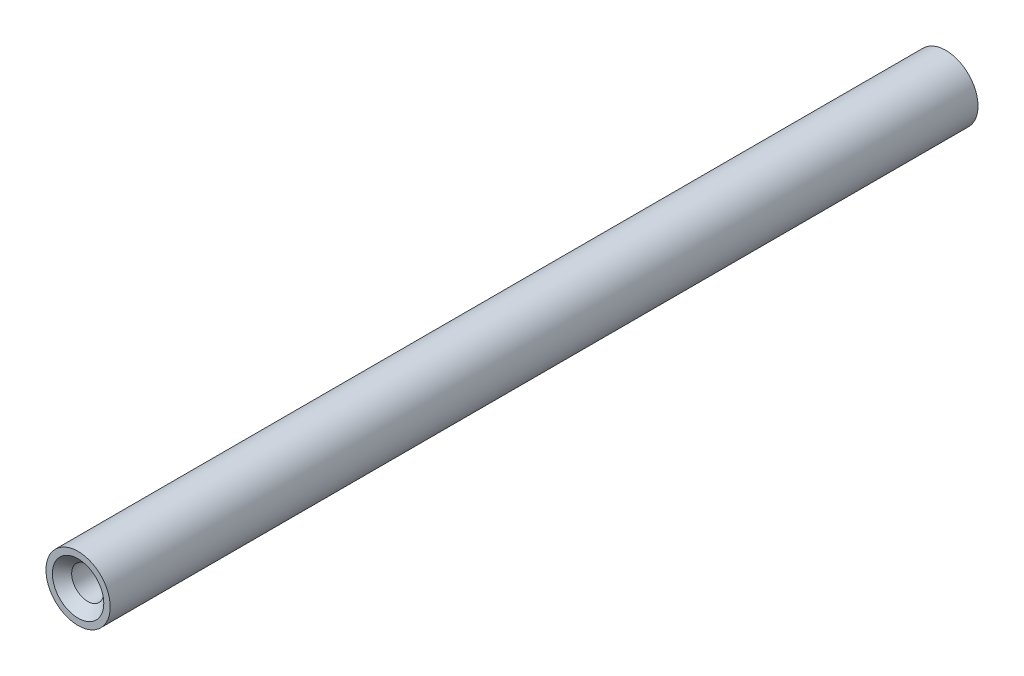
ISO-10303-21;
HEADER;
FILE_DESCRIPTION(('STEP AP214'),'2;1');
FILE_NAME('part.step','',(''),(''),'','','');
FILE_SCHEMA(('AUTOMOTIVE_DESIGN { 1 0 10303 214 1 1 1 1 }'));
ENDSEC;
DATA;
#1=APPLICATION_CONTEXT('core data for automotive mechanical design processes');
#2=APPLICATION_PROTOCOL_DEFINITION('international standard','automotive_design',2000,#1);
#3=PRODUCT_CONTEXT('',#1,'mechanical');
#4=PRODUCT('Part','Part','',(#3));
#5=PRODUCT_RELATED_PRODUCT_CATEGORY('part','',(#4));
#6=PRODUCT_DEFINITION_FORMATION('','',#4);
#7=PRODUCT_DEFINITION_CONTEXT('part definition',#1,'design');
#8=PRODUCT_DEFINITION('design','',#6,#7);
#9=PRODUCT_DEFINITION_SHAPE('','',#8);
#10=(LENGTH_UNIT() NAMED_UNIT(*) SI_UNIT(.MILLI.,.METRE.));
#11=(NAMED_UNIT(*) PLANE_ANGLE_UNIT() SI_UNIT($,.RADIAN.));
#12=(NAMED_UNIT(*) SI_UNIT($,.STERADIAN.) SOLID_ANGLE_UNIT());
#13=UNCERTAINTY_MEASURE_WITH_UNIT(LENGTH_MEASURE(1.E-05),#10,'distance_accuracy_value','');
#14=(GEOMETRIC_REPRESENTATION_CONTEXT(3) GLOBAL_UNCERTAINTY_ASSIGNED_CONTEXT((#13)) GLOBAL_UNIT_ASSIGNED_CONTEXT((#10,
#11,#12)) REPRESENTATION_CONTEXT('',''));
#15=CARTESIAN_POINT('',(0.,0.,0.));
#16=DIRECTION('',(0.,0.,1.));
#17=DIRECTION('',(1.,0.,0.));
#18=AXIS2_PLACEMENT_3D('',#15,#16,#17);
#19=CARTESIAN_POINT('',(0.,0.,54.));
#20=DIRECTION('',(0.,0.,1.));
#21=DIRECTION('',(1.,0.,0.));
#22=AXIS2_PLACEMENT_3D('',#19,#20,#21);
#23=PLANE('',#22);
#24=CARTESIAN_POINT('',(0.,0.,54.));
#25=DIRECTION('',(0.,0.,1.));
#26=DIRECTION('',(1.,0.,0.));
#27=AXIS2_PLACEMENT_3D('',#24,#25,#26);
#28=CIRCLE('',#27,1.6);
#29=CARTESIAN_POINT('',(1.6,0.,54.));
#30=VERTEX_POINT('',#29);
#31=EDGE_CURVE('E10',#30,#30,#28,.F.);
#32=ORIENTED_EDGE('',*,*,#31,.T.);
#33=EDGE_LOOP('',(#32));
#34=FACE_BOUND('',#33,.T.);
#35=CARTESIAN_POINT('',(0.,0.,54.));
#36=DIRECTION('',(0.,0.,1.));
#37=DIRECTION('',(1.,0.,0.));
#38=AXIS2_PLACEMENT_3D('',#35,#36,#37);
#39=CIRCLE('',#38,2.);
#40=CARTESIAN_POINT('',(2.,0.,54.));
#41=VERTEX_POINT('',#40);
#42=EDGE_CURVE('E27',#41,#41,#39,.T.);
#43=ORIENTED_EDGE('',*,*,#42,.T.);
#44=EDGE_LOOP('',(#43));
#45=FACE_BOUND('',#44,.T.);
#46=ADVANCED_FACE('F15',(#34,#45),#23,.T.);
#47=CARTESIAN_POINT('',(0.,0.,0.));
#48=DIRECTION('',(0.,0.,1.));
#49=DIRECTION('',(1.,0.,0.));
#50=AXIS2_PLACEMENT_3D('',#47,#48,#49);
#51=PLANE('',#50);
#52=CARTESIAN_POINT('',(0.,0.,0.));
#53=DIRECTION('',(0.,0.,1.));
#54=DIRECTION('',(1.,0.,0.));
#55=AXIS2_PLACEMENT_3D('',#52,#53,#54);
#56=CIRCLE('',#55,2.);
#57=CARTESIAN_POINT('',(2.,0.,0.));
#58=VERTEX_POINT('',#57);
#59=EDGE_CURVE('E28',#58,#58,#56,.T.);
#60=ORIENTED_EDGE('',*,*,#59,.F.);
#61=EDGE_LOOP('',(#60));
#62=FACE_BOUND('',#61,.T.);
#63=CARTESIAN_POINT('',(0.,0.,0.));
#64=DIRECTION('',(0.,0.,1.));
#65=DIRECTION('',(1.,0.,0.));
#66=AXIS2_PLACEMENT_3D('',#63,#64,#65);
#67=CIRCLE('',#66,1.);
#68=CARTESIAN_POINT('',(1.,0.,0.));
#69=VERTEX_POINT('',#68);
#70=EDGE_CURVE('E35',#69,#69,#67,.T.);
#71=ORIENTED_EDGE('',*,*,#70,.T.);
#72=EDGE_LOOP('',(#71));
#73=FACE_BOUND('',#72,.T.);
#74=ADVANCED_FACE('F39',(#62,#73),#51,.F.);
#75=CARTESIAN_POINT('',(0.,0.,54.));
#76=DIRECTION('',(0.,0.,-1.));
#77=DIRECTION('',(-1.,0.,0.));
#78=AXIS2_PLACEMENT_3D('',#75,#76,#77);
#79=CYLINDRICAL_SURFACE('',#78,2.);
#80=ORIENTED_EDGE('',*,*,#42,.F.);
#81=EDGE_LOOP('',(#80));
#82=FACE_BOUND('',#81,.T.);
#83=ORIENTED_EDGE('',*,*,#59,.T.);
#84=EDGE_LOOP('',(#83));
#85=FACE_BOUND('',#84,.T.);
#86=ADVANCED_FACE('F43',(#82,#85),#79,.T.);
#87=CARTESIAN_POINT('',(0.,0.,54.));
#88=DIRECTION('',(0.,0.,-1.));
#89=DIRECTION('',(-1.,0.,0.));
#90=AXIS2_PLACEMENT_3D('',#87,#88,#89);
#91=CYLINDRICAL_SURFACE('',#90,1.);
#92=CARTESIAN_POINT('',(0.,0.,53.4));
#93=DIRECTION('',(0.,0.,1.));
#94=DIRECTION('',(1.,0.,0.));
#95=AXIS2_PLACEMENT_3D('',#92,#93,#94);
#96=CIRCLE('',#95,1.);
#97=CARTESIAN_POINT('',(1.,0.,53.4));
#98=VERTEX_POINT('',#97);
#99=EDGE_CURVE('E22',#98,#98,#96,.T.);
#100=ORIENTED_EDGE('',*,*,#99,.T.);
#101=EDGE_LOOP('',(#100));
#102=FACE_BOUND('',#101,.T.);
#103=ORIENTED_EDGE('',*,*,#70,.F.);
#104=EDGE_LOOP('',(#103));
#105=FACE_BOUND('',#104,.T.);
#106=ADVANCED_FACE('F41',(#102,#105),#91,.F.);
#107=CARTESIAN_POINT('',(0.,0.,53.4));
#108=DIRECTION('',(0.,0.,1.));
#109=DIRECTION('',(1.,0.,0.));
#110=AXIS2_PLACEMENT_3D('',#107,#108,#109);
#111=CONICAL_SURFACE('',#110,1.,0.785398163397443);
#112=ORIENTED_EDGE('',*,*,#31,.F.);
#113=EDGE_LOOP('',(#112));
#114=FACE_BOUND('',#113,.T.);
#115=ORIENTED_EDGE('',*,*,#99,.F.);
#116=EDGE_LOOP('',(#115));
#117=FACE_BOUND('',#116,.T.);
#118=ADVANCED_FACE('F17',(#114,#117),#111,.F.);
#119=CLOSED_SHELL('',(#46,#74,#86,#106,#118));
#120=MANIFOLD_SOLID_BREP('B1',#119);
#121=ADVANCED_BREP_SHAPE_REPRESENTATION('',(#18,#120),#14);
#122=SHAPE_DEFINITION_REPRESENTATION(#9,#121);
ENDSEC;
END-ISO-10303-21;
